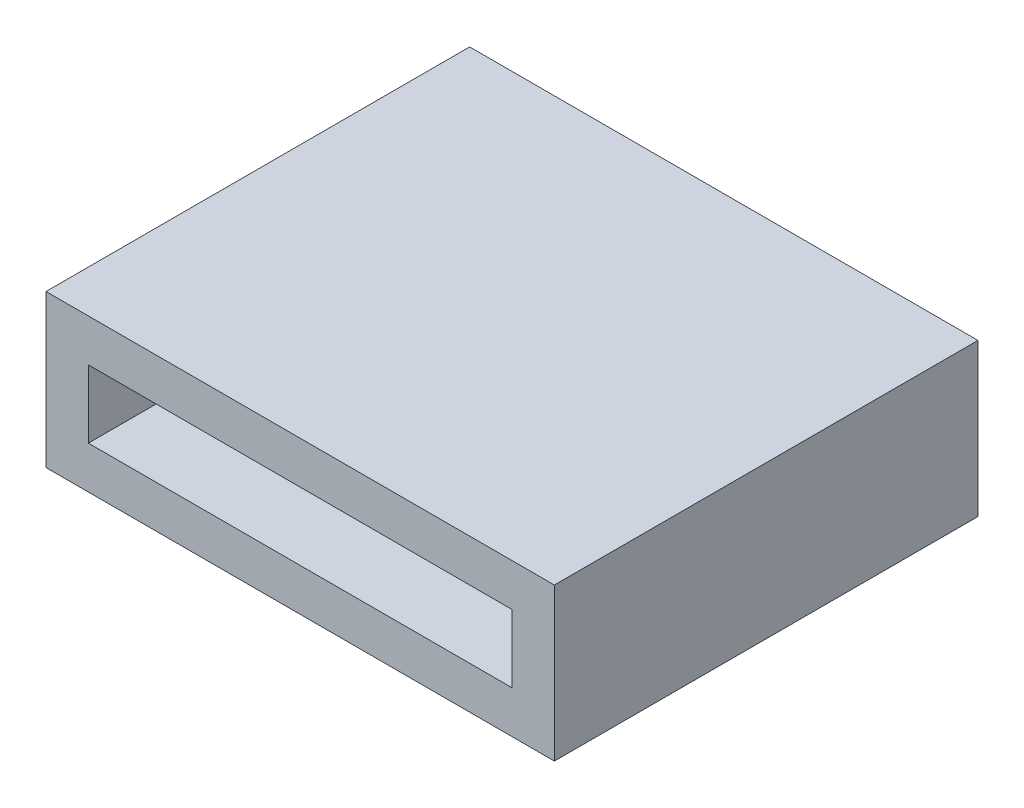
ISO-10303-21;
HEADER;
FILE_DESCRIPTION(('STEP AP214'),'2;1');
FILE_NAME('part.step','',(''),(''),'','','');
FILE_SCHEMA(('AUTOMOTIVE_DESIGN { 1 0 10303 214 1 1 1 1 }'));
ENDSEC;
DATA;
#1=APPLICATION_CONTEXT('core data for automotive mechanical design processes');
#2=APPLICATION_PROTOCOL_DEFINITION('international standard','automotive_design',2000,#1);
#3=PRODUCT_CONTEXT('',#1,'mechanical');
#4=PRODUCT('Part','Part','',(#3));
#5=PRODUCT_RELATED_PRODUCT_CATEGORY('part','',(#4));
#6=PRODUCT_DEFINITION_FORMATION('','',#4);
#7=PRODUCT_DEFINITION_CONTEXT('part definition',#1,'design');
#8=PRODUCT_DEFINITION('design','',#6,#7);
#9=PRODUCT_DEFINITION_SHAPE('','',#8);
#10=(LENGTH_UNIT() NAMED_UNIT(*) SI_UNIT(.MILLI.,.METRE.));
#11=(NAMED_UNIT(*) PLANE_ANGLE_UNIT() SI_UNIT($,.RADIAN.));
#12=(NAMED_UNIT(*) SI_UNIT($,.STERADIAN.) SOLID_ANGLE_UNIT());
#13=UNCERTAINTY_MEASURE_WITH_UNIT(LENGTH_MEASURE(1.E-05),#10,'distance_accuracy_value','');
#14=(GEOMETRIC_REPRESENTATION_CONTEXT(3) GLOBAL_UNCERTAINTY_ASSIGNED_CONTEXT((#13)) GLOBAL_UNIT_ASSIGNED_CONTEXT((#10,
#11,#12)) REPRESENTATION_CONTEXT('',''));
#15=CARTESIAN_POINT('',(0.,0.,0.));
#16=DIRECTION('',(0.,0.,1.));
#17=DIRECTION('',(1.,0.,0.));
#18=AXIS2_PLACEMENT_3D('',#15,#16,#17);
#19=CARTESIAN_POINT('',(0.,0.,50.));
#20=DIRECTION('',(1.,0.,0.));
#21=DIRECTION('',(0.,0.,-1.));
#22=AXIS2_PLACEMENT_3D('',#19,#20,#21);
#23=PLANE('',#22);
#24=DIRECTION('',(0.,0.,-1.));
#25=VECTOR('',#24,1.);
#26=CARTESIAN_POINT('',(0.,8.,50.));
#27=LINE('',#26,#25);
#28=CARTESIAN_POINT('',(0.,8.,24.5));
#29=VERTEX_POINT('',#28);
#30=CARTESIAN_POINT('',(0.,8.,0.));
#31=VERTEX_POINT('',#30);
#32=EDGE_CURVE('E137',#29,#31,#27,.T.);
#33=ORIENTED_EDGE('',*,*,#32,.F.);
#34=DIRECTION('',(0.,-1.,0.));
#35=VECTOR('',#34,1.);
#36=CARTESIAN_POINT('',(0.,8.,24.5));
#37=LINE('',#36,#35);
#38=CARTESIAN_POINT('',(0.,0.,24.5));
#39=VERTEX_POINT('',#38);
#40=EDGE_CURVE('E155',#29,#39,#37,.T.);
#41=ORIENTED_EDGE('',*,*,#40,.T.);
#42=DIRECTION('',(0.,0.,-1.));
#43=VECTOR('',#42,1.);
#44=CARTESIAN_POINT('',(0.,0.,50.));
#45=LINE('',#44,#43);
#46=CARTESIAN_POINT('',(0.,0.,0.));
#47=VERTEX_POINT('',#46);
#48=EDGE_CURVE('E187',#39,#47,#45,.T.);
#49=ORIENTED_EDGE('',*,*,#48,.T.);
#50=DIRECTION('',(0.,-1.,0.));
#51=VECTOR('',#50,1.);
#52=CARTESIAN_POINT('',(0.,0.,0.));
#53=LINE('',#52,#51);
#54=EDGE_CURVE('E147',#31,#47,#53,.T.);
#55=ORIENTED_EDGE('',*,*,#54,.F.);
#56=EDGE_LOOP('',(#33,#41,#49,#55));
#57=FACE_BOUND('',#56,.T.);
#58=ADVANCED_FACE('F36',(#57),#23,.T.);
#59=CARTESIAN_POINT('',(0.,0.,50.));
#60=DIRECTION('',(0.,1.,0.));
#61=DIRECTION('',(0.,0.,1.));
#62=AXIS2_PLACEMENT_3D('',#59,#60,#61);
#63=PLANE('',#62);
#64=ORIENTED_EDGE('',*,*,#48,.F.);
#65=DIRECTION('',(1.,0.,0.));
#66=VECTOR('',#65,1.);
#67=CARTESIAN_POINT('',(0.,0.,24.5));
#68=LINE('',#67,#66);
#69=CARTESIAN_POINT('',(50.,0.,24.5));
#70=VERTEX_POINT('',#69);
#71=EDGE_CURVE('E158',#39,#70,#68,.T.);
#72=ORIENTED_EDGE('',*,*,#71,.T.);
#73=DIRECTION('',(0.,0.,-1.));
#74=VECTOR('',#73,1.);
#75=CARTESIAN_POINT('',(50.,0.,50.));
#76=LINE('',#75,#74);
#77=CARTESIAN_POINT('',(50.,0.,0.));
#78=VERTEX_POINT('',#77);
#79=EDGE_CURVE('E184',#70,#78,#76,.T.);
#80=ORIENTED_EDGE('',*,*,#79,.T.);
#81=DIRECTION('',(1.,0.,0.));
#82=VECTOR('',#81,1.);
#83=CARTESIAN_POINT('',(0.,0.,0.));
#84=LINE('',#83,#82);
#85=EDGE_CURVE('E150',#47,#78,#84,.T.);
#86=ORIENTED_EDGE('',*,*,#85,.F.);
#87=EDGE_LOOP('',(#64,#72,#80,#86));
#88=FACE_BOUND('',#87,.T.);
#89=ADVANCED_FACE('F243',(#88),#63,.T.);
#90=CARTESIAN_POINT('',(50.,0.,50.));
#91=DIRECTION('',(-1.,0.,0.));
#92=DIRECTION('',(0.,0.,1.));
#93=AXIS2_PLACEMENT_3D('',#90,#91,#92);
#94=PLANE('',#93);
#95=ORIENTED_EDGE('',*,*,#79,.F.);
#96=DIRECTION('',(0.,1.,0.));
#97=VECTOR('',#96,1.);
#98=CARTESIAN_POINT('',(50.,8.,24.5));
#99=LINE('',#98,#97);
#100=CARTESIAN_POINT('',(50.,8.,24.5));
#101=VERTEX_POINT('',#100);
#102=EDGE_CURVE('E161',#70,#101,#99,.T.);
#103=ORIENTED_EDGE('',*,*,#102,.T.);
#104=DIRECTION('',(0.,0.,-1.));
#105=VECTOR('',#104,1.);
#106=CARTESIAN_POINT('',(50.,8.,50.));
#107=LINE('',#106,#105);
#108=CARTESIAN_POINT('',(50.,8.,0.));
#109=VERTEX_POINT('',#108);
#110=EDGE_CURVE('E136',#101,#109,#107,.T.);
#111=ORIENTED_EDGE('',*,*,#110,.T.);
#112=DIRECTION('',(0.,1.,0.));
#113=VECTOR('',#112,1.);
#114=CARTESIAN_POINT('',(50.,0.,0.));
#115=LINE('',#114,#113);
#116=EDGE_CURVE('E177',#78,#109,#115,.T.);
#117=ORIENTED_EDGE('',*,*,#116,.F.);
#118=EDGE_LOOP('',(#95,#103,#111,#117));
#119=FACE_BOUND('',#118,.T.);
#120=ADVANCED_FACE('F249',(#119),#94,.T.);
#121=CARTESIAN_POINT('',(0.,8.,50.));
#122=DIRECTION('',(0.,-1.,0.));
#123=DIRECTION('',(0.,0.,-1.));
#124=AXIS2_PLACEMENT_3D('',#121,#122,#123);
#125=PLANE('',#124);
#126=ORIENTED_EDGE('',*,*,#110,.F.);
#127=DIRECTION('',(-1.,0.,0.));
#128=VECTOR('',#127,1.);
#129=CARTESIAN_POINT('',(0.,8.,24.5));
#130=LINE('',#129,#128);
#131=EDGE_CURVE('E144',#101,#29,#130,.T.);
#132=ORIENTED_EDGE('',*,*,#131,.T.);
#133=ORIENTED_EDGE('',*,*,#32,.T.);
#134=DIRECTION('',(-1.,0.,0.));
#135=VECTOR('',#134,1.);
#136=CARTESIAN_POINT('',(0.,8.,0.));
#137=LINE('',#136,#135);
#138=EDGE_CURVE('E169',#109,#31,#137,.T.);
#139=ORIENTED_EDGE('',*,*,#138,.F.);
#140=EDGE_LOOP('',(#126,#132,#133,#139));
#141=FACE_BOUND('',#140,.T.);
#142=ADVANCED_FACE('F267',(#141),#125,.T.);
#143=CARTESIAN_POINT('',(0.,0.,50.));
#144=DIRECTION('',(0.,0.,1.));
#145=DIRECTION('',(1.,0.,0.));
#146=AXIS2_PLACEMENT_3D('',#143,#144,#145);
#147=PLANE('',#146);
#148=DIRECTION('',(1.,0.,0.));
#149=VECTOR('',#148,1.);
#150=CARTESIAN_POINT('',(-5.,-5.,50.));
#151=LINE('',#150,#149);
#152=CARTESIAN_POINT('',(-5.,-5.,50.));
#153=VERTEX_POINT('',#152);
#154=CARTESIAN_POINT('',(55.,-5.,50.));
#155=VERTEX_POINT('',#154);
#156=EDGE_CURVE('E190',#153,#155,#151,.T.);
#157=ORIENTED_EDGE('',*,*,#156,.T.);
#158=DIRECTION('',(0.,1.,0.));
#159=VECTOR('',#158,1.);
#160=CARTESIAN_POINT('',(55.,-5.,50.));
#161=LINE('',#160,#159);
#162=CARTESIAN_POINT('',(55.,13.,50.));
#163=VERTEX_POINT('',#162);
#164=EDGE_CURVE('E193',#155,#163,#161,.T.);
#165=ORIENTED_EDGE('',*,*,#164,.T.);
#166=DIRECTION('',(-1.,0.,0.));
#167=VECTOR('',#166,1.);
#168=CARTESIAN_POINT('',(-5.,13.,50.));
#169=LINE('',#168,#167);
#170=CARTESIAN_POINT('',(-5.,13.,50.));
#171=VERTEX_POINT('',#170);
#172=EDGE_CURVE('E196',#163,#171,#169,.T.);
#173=ORIENTED_EDGE('',*,*,#172,.T.);
#174=DIRECTION('',(0.,-1.,0.));
#175=VECTOR('',#174,1.);
#176=CARTESIAN_POINT('',(-5.,-5.,50.));
#177=LINE('',#176,#175);
#178=EDGE_CURVE('E198',#171,#153,#177,.T.);
#179=ORIENTED_EDGE('',*,*,#178,.T.);
#180=EDGE_LOOP('',(#157,#165,#173,#179));
#181=FACE_BOUND('',#180,.T.);
#182=DIRECTION('',(1.,0.,0.));
#183=VECTOR('',#182,1.);
#184=CARTESIAN_POINT('',(0.,0.,50.));
#185=LINE('',#184,#183);
#186=CARTESIAN_POINT('',(0.,0.,50.));
#187=VERTEX_POINT('',#186);
#188=CARTESIAN_POINT('',(50.,0.,50.));
#189=VERTEX_POINT('',#188);
#190=EDGE_CURVE('E168',#187,#189,#185,.T.);
#191=ORIENTED_EDGE('',*,*,#190,.F.);
#192=DIRECTION('',(0.,-1.,0.));
#193=VECTOR('',#192,1.);
#194=CARTESIAN_POINT('',(0.,0.,50.));
#195=LINE('',#194,#193);
#196=CARTESIAN_POINT('',(0.,8.,50.));
#197=VERTEX_POINT('',#196);
#198=EDGE_CURVE('E166',#197,#187,#195,.T.);
#199=ORIENTED_EDGE('',*,*,#198,.F.);
#200=DIRECTION('',(-1.,0.,0.));
#201=VECTOR('',#200,1.);
#202=CARTESIAN_POINT('',(0.,8.,50.));
#203=LINE('',#202,#201);
#204=CARTESIAN_POINT('',(50.,8.,50.));
#205=VERTEX_POINT('',#204);
#206=EDGE_CURVE('E133',#205,#197,#203,.T.);
#207=ORIENTED_EDGE('',*,*,#206,.F.);
#208=DIRECTION('',(0.,1.,0.));
#209=VECTOR('',#208,1.);
#210=CARTESIAN_POINT('',(50.,0.,50.));
#211=LINE('',#210,#209);
#212=EDGE_CURVE('E171',#189,#205,#211,.T.);
#213=ORIENTED_EDGE('',*,*,#212,.F.);
#214=EDGE_LOOP('',(#191,#199,#207,#213));
#215=FACE_BOUND('',#214,.T.);
#216=ADVANCED_FACE('F233',(#181,#215),#147,.T.);
#217=CARTESIAN_POINT('',(0.,0.,0.));
#218=DIRECTION('',(0.,0.,1.));
#219=DIRECTION('',(1.,0.,0.));
#220=AXIS2_PLACEMENT_3D('',#217,#218,#219);
#221=PLANE('',#220);
#222=DIRECTION('',(1.,0.,0.));
#223=VECTOR('',#222,1.);
#224=CARTESIAN_POINT('',(-5.,-5.,0.));
#225=LINE('',#224,#223);
#226=CARTESIAN_POINT('',(-5.,-5.,0.));
#227=VERTEX_POINT('',#226);
#228=CARTESIAN_POINT('',(55.,-5.,0.));
#229=VERTEX_POINT('',#228);
#230=EDGE_CURVE('E189',#227,#229,#225,.T.);
#231=ORIENTED_EDGE('',*,*,#230,.F.);
#232=DIRECTION('',(0.,-1.,0.));
#233=VECTOR('',#232,1.);
#234=CARTESIAN_POINT('',(-5.,-5.,0.));
#235=LINE('',#234,#233);
#236=CARTESIAN_POINT('',(-5.,13.,0.));
#237=VERTEX_POINT('',#236);
#238=EDGE_CURVE('E194',#237,#227,#235,.T.);
#239=ORIENTED_EDGE('',*,*,#238,.F.);
#240=DIRECTION('',(-1.,0.,0.));
#241=VECTOR('',#240,1.);
#242=CARTESIAN_POINT('',(-5.,13.,0.));
#243=LINE('',#242,#241);
#244=CARTESIAN_POINT('',(55.,13.,0.));
#245=VERTEX_POINT('',#244);
#246=EDGE_CURVE('E205',#245,#237,#243,.T.);
#247=ORIENTED_EDGE('',*,*,#246,.F.);
#248=DIRECTION('',(0.,1.,0.));
#249=VECTOR('',#248,1.);
#250=CARTESIAN_POINT('',(55.,-5.,0.));
#251=LINE('',#250,#249);
#252=EDGE_CURVE('E203',#229,#245,#251,.T.);
#253=ORIENTED_EDGE('',*,*,#252,.F.);
#254=EDGE_LOOP('',(#231,#239,#247,#253));
#255=FACE_BOUND('',#254,.T.);
#256=ORIENTED_EDGE('',*,*,#54,.T.);
#257=ORIENTED_EDGE('',*,*,#85,.T.);
#258=ORIENTED_EDGE('',*,*,#116,.T.);
#259=ORIENTED_EDGE('',*,*,#138,.T.);
#260=EDGE_LOOP('',(#256,#257,#258,#259));
#261=FACE_BOUND('',#260,.T.);
#262=ADVANCED_FACE('F223',(#255,#261),#221,.F.);
#263=CARTESIAN_POINT('',(-5.,-5.,50.));
#264=DIRECTION('',(0.,1.,0.));
#265=DIRECTION('',(0.,0.,1.));
#266=AXIS2_PLACEMENT_3D('',#263,#264,#265);
#267=PLANE('',#266);
#268=ORIENTED_EDGE('',*,*,#230,.T.);
#269=DIRECTION('',(0.,0.,-1.));
#270=VECTOR('',#269,1.);
#271=CARTESIAN_POINT('',(55.,-5.,50.));
#272=LINE('',#271,#270);
#273=EDGE_CURVE('E11',#155,#229,#272,.T.);
#274=ORIENTED_EDGE('',*,*,#273,.F.);
#275=ORIENTED_EDGE('',*,*,#156,.F.);
#276=DIRECTION('',(0.,0.,-1.));
#277=VECTOR('',#276,1.);
#278=CARTESIAN_POINT('',(-5.,-5.,50.));
#279=LINE('',#278,#277);
#280=EDGE_CURVE('E200',#153,#227,#279,.T.);
#281=ORIENTED_EDGE('',*,*,#280,.T.);
#282=EDGE_LOOP('',(#268,#274,#275,#281));
#283=FACE_BOUND('',#282,.T.);
#284=ADVANCED_FACE('F38',(#283),#267,.F.);
#285=CARTESIAN_POINT('',(55.,-5.,50.));
#286=DIRECTION('',(-1.,0.,0.));
#287=DIRECTION('',(0.,0.,1.));
#288=AXIS2_PLACEMENT_3D('',#285,#286,#287);
#289=PLANE('',#288);
#290=ORIENTED_EDGE('',*,*,#252,.T.);
#291=DIRECTION('',(0.,0.,-1.));
#292=VECTOR('',#291,1.);
#293=CARTESIAN_POINT('',(55.,13.,50.));
#294=LINE('',#293,#292);
#295=EDGE_CURVE('E44',#163,#245,#294,.T.);
#296=ORIENTED_EDGE('',*,*,#295,.F.);
#297=ORIENTED_EDGE('',*,*,#164,.F.);
#298=ORIENTED_EDGE('',*,*,#273,.T.);
#299=EDGE_LOOP('',(#290,#296,#297,#298));
#300=FACE_BOUND('',#299,.T.);
#301=ADVANCED_FACE('F235',(#300),#289,.F.);
#302=CARTESIAN_POINT('',(-5.,13.,50.));
#303=DIRECTION('',(0.,-1.,0.));
#304=DIRECTION('',(0.,0.,-1.));
#305=AXIS2_PLACEMENT_3D('',#302,#303,#304);
#306=PLANE('',#305);
#307=ORIENTED_EDGE('',*,*,#246,.T.);
#308=DIRECTION('',(0.,0.,-1.));
#309=VECTOR('',#308,1.);
#310=CARTESIAN_POINT('',(-5.,13.,50.));
#311=LINE('',#310,#309);
#312=EDGE_CURVE('E210',#171,#237,#311,.T.);
#313=ORIENTED_EDGE('',*,*,#312,.F.);
#314=ORIENTED_EDGE('',*,*,#172,.F.);
#315=ORIENTED_EDGE('',*,*,#295,.T.);
#316=EDGE_LOOP('',(#307,#313,#314,#315));
#317=FACE_BOUND('',#316,.T.);
#318=ADVANCED_FACE('F217',(#317),#306,.F.);
#319=CARTESIAN_POINT('',(-5.,-5.,50.));
#320=DIRECTION('',(1.,0.,0.));
#321=DIRECTION('',(0.,0.,-1.));
#322=AXIS2_PLACEMENT_3D('',#319,#320,#321);
#323=PLANE('',#322);
#324=ORIENTED_EDGE('',*,*,#238,.T.);
#325=ORIENTED_EDGE('',*,*,#280,.F.);
#326=ORIENTED_EDGE('',*,*,#178,.F.);
#327=ORIENTED_EDGE('',*,*,#312,.T.);
#328=EDGE_LOOP('',(#324,#325,#326,#327));
#329=FACE_BOUND('',#328,.T.);
#330=ADVANCED_FACE('F227',(#329),#323,.F.);
#331=DIRECTION('',(0.,-1.,0.));
#332=VECTOR('',#331,1.);
#333=CARTESIAN_POINT('',(0.,8.,25.5));
#334=LINE('',#333,#332);
#335=CARTESIAN_POINT('',(0.,8.,25.5));
#336=VERTEX_POINT('',#335);
#337=CARTESIAN_POINT('',(0.,0.,25.5));
#338=VERTEX_POINT('',#337);
#339=EDGE_CURVE('E140',#336,#338,#334,.T.);
#340=ORIENTED_EDGE('',*,*,#339,.F.);
#341=EDGE_CURVE('E127',#197,#336,#27,.T.);
#342=ORIENTED_EDGE('',*,*,#341,.F.);
#343=ORIENTED_EDGE('',*,*,#198,.T.);
#344=EDGE_CURVE('E142',#187,#338,#45,.T.);
#345=ORIENTED_EDGE('',*,*,#344,.T.);
#346=EDGE_LOOP('',(#340,#342,#343,#345));
#347=FACE_BOUND('',#346,.T.);
#348=ADVANCED_FACE('F141',(#347),#23,.T.);
#349=DIRECTION('',(1.,0.,0.));
#350=VECTOR('',#349,1.);
#351=CARTESIAN_POINT('',(0.,0.,25.5));
#352=LINE('',#351,#350);
#353=CARTESIAN_POINT('',(50.,0.,25.5));
#354=VERTEX_POINT('',#353);
#355=EDGE_CURVE('E51',#338,#354,#352,.T.);
#356=ORIENTED_EDGE('',*,*,#355,.F.);
#357=ORIENTED_EDGE('',*,*,#344,.F.);
#358=ORIENTED_EDGE('',*,*,#190,.T.);
#359=EDGE_CURVE('E185',#189,#354,#76,.T.);
#360=ORIENTED_EDGE('',*,*,#359,.T.);
#361=EDGE_LOOP('',(#356,#357,#358,#360));
#362=FACE_BOUND('',#361,.T.);
#363=ADVANCED_FACE('F252',(#362),#63,.T.);
#364=DIRECTION('',(0.,1.,0.));
#365=VECTOR('',#364,1.);
#366=CARTESIAN_POINT('',(50.,8.,25.5));
#367=LINE('',#366,#365);
#368=CARTESIAN_POINT('',(50.,8.,25.5));
#369=VERTEX_POINT('',#368);
#370=EDGE_CURVE('E59',#354,#369,#367,.T.);
#371=ORIENTED_EDGE('',*,*,#370,.F.);
#372=ORIENTED_EDGE('',*,*,#359,.F.);
#373=ORIENTED_EDGE('',*,*,#212,.T.);
#374=EDGE_CURVE('E182',#205,#369,#107,.T.);
#375=ORIENTED_EDGE('',*,*,#374,.T.);
#376=EDGE_LOOP('',(#371,#372,#373,#375));
#377=FACE_BOUND('',#376,.T.);
#378=ADVANCED_FACE('F260',(#377),#94,.T.);
#379=DIRECTION('',(-1.,0.,0.));
#380=VECTOR('',#379,1.);
#381=CARTESIAN_POINT('',(0.,8.,25.5));
#382=LINE('',#381,#380);
#383=EDGE_CURVE('E131',#369,#336,#382,.T.);
#384=ORIENTED_EDGE('',*,*,#383,.F.);
#385=ORIENTED_EDGE('',*,*,#374,.F.);
#386=ORIENTED_EDGE('',*,*,#206,.T.);
#387=ORIENTED_EDGE('',*,*,#341,.T.);
#388=EDGE_LOOP('',(#384,#385,#386,#387));
#389=FACE_BOUND('',#388,.T.);
#390=ADVANCED_FACE('F129',(#389),#125,.T.);
#391=CARTESIAN_POINT('',(0.,0.,24.5));
#392=DIRECTION('',(0.,0.,1.));
#393=DIRECTION('',(1.,0.,0.));
#394=AXIS2_PLACEMENT_3D('',#391,#392,#393);
#395=PLANE('',#394);
#396=ORIENTED_EDGE('',*,*,#40,.F.);
#397=ORIENTED_EDGE('',*,*,#131,.F.);
#398=ORIENTED_EDGE('',*,*,#102,.F.);
#399=ORIENTED_EDGE('',*,*,#71,.F.);
#400=EDGE_LOOP('',(#396,#397,#398,#399));
#401=FACE_BOUND('',#400,.T.);
#402=ADVANCED_FACE('F281',(#401),#395,.F.);
#403=CARTESIAN_POINT('',(0.,0.,25.5));
#404=DIRECTION('',(0.,0.,1.));
#405=DIRECTION('',(1.,0.,0.));
#406=AXIS2_PLACEMENT_3D('',#403,#404,#405);
#407=PLANE('',#406);
#408=ORIENTED_EDGE('',*,*,#339,.T.);
#409=ORIENTED_EDGE('',*,*,#355,.T.);
#410=ORIENTED_EDGE('',*,*,#370,.T.);
#411=ORIENTED_EDGE('',*,*,#383,.T.);
#412=EDGE_LOOP('',(#408,#409,#410,#411));
#413=FACE_BOUND('',#412,.T.);
#414=ADVANCED_FACE('F146',(#413),#407,.T.);
#415=CLOSED_SHELL('',(#58,#89,#120,#142,#216,#262,#284,#301,#318,#330,#348,#363,#378,#390,#402,#414));
#416=MANIFOLD_SOLID_BREP('B2',#415);
#417=ADVANCED_BREP_SHAPE_REPRESENTATION('',(#18,#416),#14);
#418=SHAPE_DEFINITION_REPRESENTATION(#9,#417);
ENDSEC;
END-ISO-10303-21;
